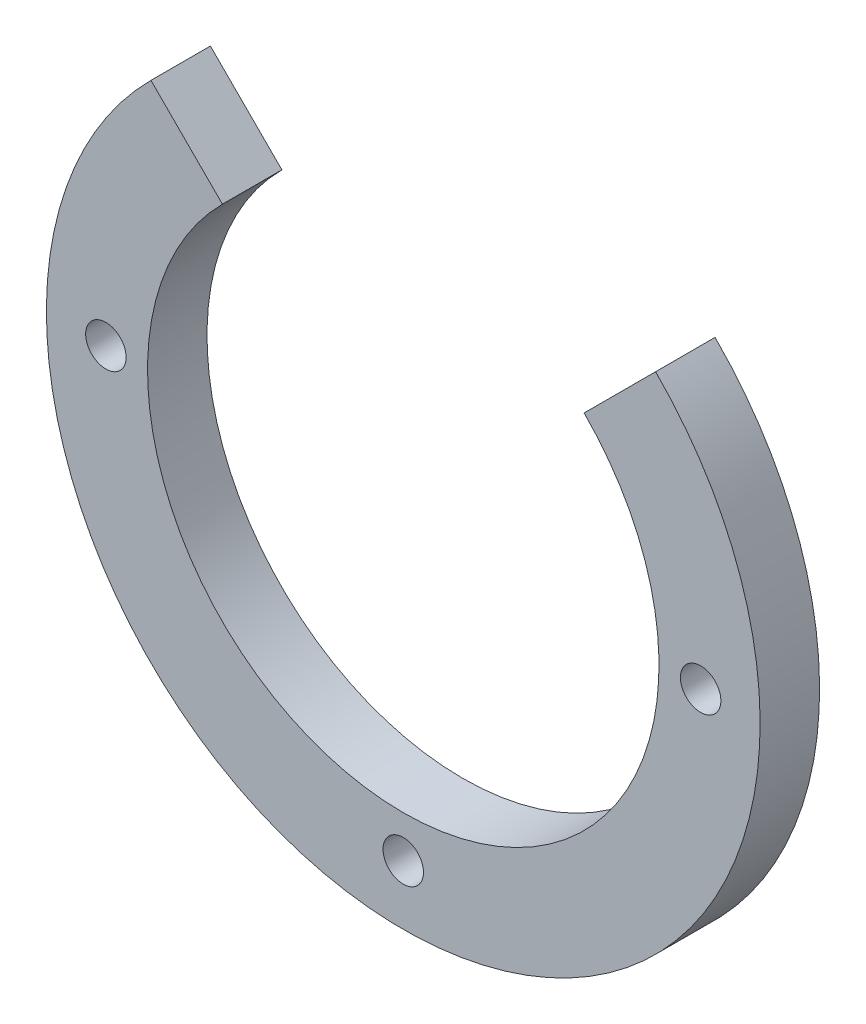
ISO-10303-21;
HEADER;
FILE_DESCRIPTION(('STEP AP214'),'2;1');
FILE_NAME('part.step','',(''),(''),'','','');
FILE_SCHEMA(('AUTOMOTIVE_DESIGN { 1 0 10303 214 1 1 1 1 }'));
ENDSEC;
DATA;
#1=APPLICATION_CONTEXT('core data for automotive mechanical design processes');
#2=APPLICATION_PROTOCOL_DEFINITION('international standard','automotive_design',2000,#1);
#3=PRODUCT_CONTEXT('',#1,'mechanical');
#4=PRODUCT('Part','Part','',(#3));
#5=PRODUCT_RELATED_PRODUCT_CATEGORY('part','',(#4));
#6=PRODUCT_DEFINITION_FORMATION('','',#4);
#7=PRODUCT_DEFINITION_CONTEXT('part definition',#1,'design');
#8=PRODUCT_DEFINITION('design','',#6,#7);
#9=PRODUCT_DEFINITION_SHAPE('','',#8);
#10=(LENGTH_UNIT() NAMED_UNIT(*) SI_UNIT(.MILLI.,.METRE.));
#11=(NAMED_UNIT(*) PLANE_ANGLE_UNIT() SI_UNIT($,.RADIAN.));
#12=(NAMED_UNIT(*) SI_UNIT($,.STERADIAN.) SOLID_ANGLE_UNIT());
#13=UNCERTAINTY_MEASURE_WITH_UNIT(LENGTH_MEASURE(1.E-05),#10,'distance_accuracy_value','');
#14=(GEOMETRIC_REPRESENTATION_CONTEXT(3) GLOBAL_UNCERTAINTY_ASSIGNED_CONTEXT((#13)) GLOBAL_UNIT_ASSIGNED_CONTEXT((#10,
#11,#12)) REPRESENTATION_CONTEXT('',''));
#15=CARTESIAN_POINT('',(0.,0.,0.));
#16=DIRECTION('',(0.,0.,1.));
#17=DIRECTION('',(1.,0.,0.));
#18=AXIS2_PLACEMENT_3D('',#15,#16,#17);
#19=CARTESIAN_POINT('',(0.,0.,5.));
#20=DIRECTION('',(0.,0.,1.));
#21=DIRECTION('',(1.,0.,0.));
#22=AXIS2_PLACEMENT_3D('',#19,#20,#21);
#23=PLANE('',#22);
#24=DIRECTION('',(0.707106781186551,0.707106781186544,0.));
#25=VECTOR('',#24,1.);
#26=CARTESIAN_POINT('',(21.2132034355965,21.2132034355963,5.));
#27=LINE('',#26,#25);
#28=CARTESIAN_POINT('',(15.2027957955108,15.2027957955107,5.));
#29=VERTEX_POINT('',#28);
#30=CARTESIAN_POINT('',(21.2132034355965,21.2132034355963,5.));
#31=VERTEX_POINT('',#30);
#32=EDGE_CURVE('E78',#29,#31,#27,.T.);
#33=ORIENTED_EDGE('',*,*,#32,.F.);
#34=CARTESIAN_POINT('',(0.,0.,5.));
#35=DIRECTION('',(0.,0.,1.));
#36=DIRECTION('',(1.,0.,0.));
#37=AXIS2_PLACEMENT_3D('',#34,#35,#36);
#38=CIRCLE('',#37,21.5);
#39=CARTESIAN_POINT('',(-15.2027957955109,15.2027957955107,5.));
#40=VERTEX_POINT('',#39);
#41=EDGE_CURVE('E97',#40,#29,#38,.T.);
#42=ORIENTED_EDGE('',*,*,#41,.F.);
#43=DIRECTION('',(0.707106781186551,-0.707106781186544,0.));
#44=VECTOR('',#43,1.);
#45=CARTESIAN_POINT('',(0.,0.,5.));
#46=LINE('',#45,#44);
#47=CARTESIAN_POINT('',(-21.2132034355965,21.2132034355963,5.));
#48=VERTEX_POINT('',#47);
#49=EDGE_CURVE('E59',#48,#40,#46,.T.);
#50=ORIENTED_EDGE('',*,*,#49,.F.);
#51=CARTESIAN_POINT('',(0.,0.,5.));
#52=DIRECTION('',(0.,0.,1.));
#53=DIRECTION('',(1.,0.,0.));
#54=AXIS2_PLACEMENT_3D('',#51,#52,#53);
#55=CIRCLE('',#54,30.);
#56=EDGE_CURVE('E96',#48,#31,#55,.T.);
#57=ORIENTED_EDGE('',*,*,#56,.T.);
#58=EDGE_LOOP('',(#33,#42,#50,#57));
#59=FACE_BOUND('',#58,.T.);
#60=CARTESIAN_POINT('',(-25.,0.,5.));
#61=DIRECTION('',(0.,0.,1.));
#62=DIRECTION('',(1.,0.,0.));
#63=AXIS2_PLACEMENT_3D('',#60,#61,#62);
#64=CIRCLE('',#63,1.7);
#65=CARTESIAN_POINT('',(-23.3,0.,5.));
#66=VERTEX_POINT('',#65);
#67=EDGE_CURVE('E124',#66,#66,#64,.T.);
#68=ORIENTED_EDGE('',*,*,#67,.F.);
#69=EDGE_LOOP('',(#68));
#70=FACE_BOUND('',#69,.T.);
#71=CARTESIAN_POINT('',(0.,-25.,5.));
#72=DIRECTION('',(0.,0.,1.));
#73=DIRECTION('',(1.,0.,0.));
#74=AXIS2_PLACEMENT_3D('',#71,#72,#73);
#75=CIRCLE('',#74,1.7);
#76=CARTESIAN_POINT('',(1.7,-25.,5.));
#77=VERTEX_POINT('',#76);
#78=EDGE_CURVE('E118',#77,#77,#75,.T.);
#79=ORIENTED_EDGE('',*,*,#78,.F.);
#80=EDGE_LOOP('',(#79));
#81=FACE_BOUND('',#80,.T.);
#82=CARTESIAN_POINT('',(25.,0.,5.));
#83=DIRECTION('',(0.,0.,1.));
#84=DIRECTION('',(1.,0.,0.));
#85=AXIS2_PLACEMENT_3D('',#82,#83,#84);
#86=CIRCLE('',#85,1.7);
#87=CARTESIAN_POINT('',(26.7,0.,5.));
#88=VERTEX_POINT('',#87);
#89=EDGE_CURVE('E110',#88,#88,#86,.T.);
#90=ORIENTED_EDGE('',*,*,#89,.F.);
#91=EDGE_LOOP('',(#90));
#92=FACE_BOUND('',#91,.T.);
#93=ADVANCED_FACE('F37',(#59,#70,#81,#92),#23,.T.);
#94=CARTESIAN_POINT('',(0.,0.,0.));
#95=DIRECTION('',(0.,0.,1.));
#96=DIRECTION('',(1.,0.,0.));
#97=AXIS2_PLACEMENT_3D('',#94,#95,#96);
#98=PLANE('',#97);
#99=CARTESIAN_POINT('',(-25.,0.,0.));
#100=DIRECTION('',(0.,0.,1.));
#101=DIRECTION('',(1.,0.,0.));
#102=AXIS2_PLACEMENT_3D('',#99,#100,#101);
#103=CIRCLE('',#102,1.7);
#104=CARTESIAN_POINT('',(-23.3,0.,0.));
#105=VERTEX_POINT('',#104);
#106=EDGE_CURVE('E121',#105,#105,#103,.T.);
#107=ORIENTED_EDGE('',*,*,#106,.T.);
#108=EDGE_LOOP('',(#107));
#109=FACE_BOUND('',#108,.T.);
#110=CARTESIAN_POINT('',(0.,-25.,0.));
#111=DIRECTION('',(0.,0.,1.));
#112=DIRECTION('',(1.,0.,0.));
#113=AXIS2_PLACEMENT_3D('',#110,#111,#112);
#114=CIRCLE('',#113,1.7);
#115=CARTESIAN_POINT('',(1.7,-25.,0.));
#116=VERTEX_POINT('',#115);
#117=EDGE_CURVE('E115',#116,#116,#114,.T.);
#118=ORIENTED_EDGE('',*,*,#117,.T.);
#119=EDGE_LOOP('',(#118));
#120=FACE_BOUND('',#119,.T.);
#121=CARTESIAN_POINT('',(25.,0.,0.));
#122=DIRECTION('',(0.,0.,1.));
#123=DIRECTION('',(1.,0.,0.));
#124=AXIS2_PLACEMENT_3D('',#121,#122,#123);
#125=CIRCLE('',#124,1.7);
#126=CARTESIAN_POINT('',(26.7,0.,0.));
#127=VERTEX_POINT('',#126);
#128=EDGE_CURVE('E108',#127,#127,#125,.T.);
#129=ORIENTED_EDGE('',*,*,#128,.T.);
#130=EDGE_LOOP('',(#129));
#131=FACE_BOUND('',#130,.T.);
#132=CARTESIAN_POINT('',(0.,0.,0.));
#133=DIRECTION('',(0.,0.,1.));
#134=DIRECTION('',(1.,0.,0.));
#135=AXIS2_PLACEMENT_3D('',#132,#133,#134);
#136=CIRCLE('',#135,21.5);
#137=CARTESIAN_POINT('',(-15.2027957955109,15.2027957955107,0.));
#138=VERTEX_POINT('',#137);
#139=CARTESIAN_POINT('',(15.2027957955108,15.2027957955107,0.));
#140=VERTEX_POINT('',#139);
#141=EDGE_CURVE('E93',#138,#140,#136,.T.);
#142=ORIENTED_EDGE('',*,*,#141,.T.);
#143=DIRECTION('',(0.707106781186551,0.707106781186544,0.));
#144=VECTOR('',#143,1.);
#145=CARTESIAN_POINT('',(21.2132034355965,21.2132034355963,0.));
#146=LINE('',#145,#144);
#147=CARTESIAN_POINT('',(21.2132034355965,21.2132034355963,0.));
#148=VERTEX_POINT('',#147);
#149=EDGE_CURVE('E51',#140,#148,#146,.T.);
#150=ORIENTED_EDGE('',*,*,#149,.T.);
#151=CARTESIAN_POINT('',(0.,0.,0.));
#152=DIRECTION('',(0.,0.,1.));
#153=DIRECTION('',(1.,0.,0.));
#154=AXIS2_PLACEMENT_3D('',#151,#152,#153);
#155=CIRCLE('',#154,30.);
#156=CARTESIAN_POINT('',(-21.2132034355965,21.2132034355963,0.));
#157=VERTEX_POINT('',#156);
#158=EDGE_CURVE('E91',#157,#148,#155,.T.);
#159=ORIENTED_EDGE('',*,*,#158,.F.);
#160=DIRECTION('',(0.707106781186551,-0.707106781186544,0.));
#161=VECTOR('',#160,1.);
#162=CARTESIAN_POINT('',(0.,0.,0.));
#163=LINE('',#162,#161);
#164=EDGE_CURVE('E84',#157,#138,#163,.T.);
#165=ORIENTED_EDGE('',*,*,#164,.T.);
#166=EDGE_LOOP('',(#142,#150,#159,#165));
#167=FACE_BOUND('',#166,.T.);
#168=ADVANCED_FACE('F89',(#109,#120,#131,#167),#98,.F.);
#169=CARTESIAN_POINT('',(0.,0.,5.));
#170=DIRECTION('',(0.,0.,-1.));
#171=DIRECTION('',(-1.,0.,0.));
#172=AXIS2_PLACEMENT_3D('',#169,#170,#171);
#173=CYLINDRICAL_SURFACE('',#172,30.);
#174=ORIENTED_EDGE('',*,*,#158,.T.);
#175=DIRECTION('',(0.,0.,1.));
#176=VECTOR('',#175,1.);
#177=CARTESIAN_POINT('',(21.2132034355965,21.2132034355963,0.));
#178=LINE('',#177,#176);
#179=EDGE_CURVE('E75',#148,#31,#178,.T.);
#180=ORIENTED_EDGE('',*,*,#179,.T.);
#181=ORIENTED_EDGE('',*,*,#56,.F.);
#182=DIRECTION('',(0.,0.,1.));
#183=VECTOR('',#182,1.);
#184=CARTESIAN_POINT('',(-21.2132034355965,21.2132034355963,0.));
#185=LINE('',#184,#183);
#186=EDGE_CURVE('E83',#157,#48,#185,.T.);
#187=ORIENTED_EDGE('',*,*,#186,.F.);
#188=EDGE_LOOP('',(#174,#180,#181,#187));
#189=FACE_BOUND('',#188,.T.);
#190=ADVANCED_FACE('F39',(#189),#173,.T.);
#191=CARTESIAN_POINT('',(0.,0.,5.));
#192=DIRECTION('',(0.,0.,-1.));
#193=DIRECTION('',(-1.,0.,0.));
#194=AXIS2_PLACEMENT_3D('',#191,#192,#193);
#195=CYLINDRICAL_SURFACE('',#194,21.5);
#196=DIRECTION('',(0.,0.,-1.));
#197=VECTOR('',#196,1.);
#198=CARTESIAN_POINT('',(15.2027957955108,15.2027957955107,5.));
#199=LINE('',#198,#197);
#200=EDGE_CURVE('E11',#140,#29,#199,.F.);
#201=ORIENTED_EDGE('',*,*,#200,.F.);
#202=ORIENTED_EDGE('',*,*,#141,.F.);
#203=DIRECTION('',(0.,0.,-1.));
#204=VECTOR('',#203,1.);
#205=CARTESIAN_POINT('',(-15.2027957955109,15.2027957955107,5.));
#206=LINE('',#205,#204);
#207=EDGE_CURVE('E45',#40,#138,#206,.T.);
#208=ORIENTED_EDGE('',*,*,#207,.F.);
#209=ORIENTED_EDGE('',*,*,#41,.T.);
#210=EDGE_LOOP('',(#201,#202,#208,#209));
#211=FACE_BOUND('',#210,.T.);
#212=ADVANCED_FACE('F107',(#211),#195,.F.);
#213=CARTESIAN_POINT('',(25.,0.,5.));
#214=DIRECTION('',(0.,0.,1.));
#215=DIRECTION('',(1.,0.,0.));
#216=AXIS2_PLACEMENT_3D('',#213,#214,#215);
#217=CYLINDRICAL_SURFACE('',#216,1.7);
#218=ORIENTED_EDGE('',*,*,#128,.F.);
#219=EDGE_LOOP('',(#218));
#220=FACE_BOUND('',#219,.T.);
#221=ORIENTED_EDGE('',*,*,#89,.T.);
#222=EDGE_LOOP('',(#221));
#223=FACE_BOUND('',#222,.T.);
#224=ADVANCED_FACE('F139',(#220,#223),#217,.F.);
#225=CARTESIAN_POINT('',(0.,-25.,5.));
#226=DIRECTION('',(0.,0.,1.));
#227=DIRECTION('',(1.,0.,0.));
#228=AXIS2_PLACEMENT_3D('',#225,#226,#227);
#229=CYLINDRICAL_SURFACE('',#228,1.7);
#230=ORIENTED_EDGE('',*,*,#117,.F.);
#231=EDGE_LOOP('',(#230));
#232=FACE_BOUND('',#231,.T.);
#233=ORIENTED_EDGE('',*,*,#78,.T.);
#234=EDGE_LOOP('',(#233));
#235=FACE_BOUND('',#234,.T.);
#236=ADVANCED_FACE('F141',(#232,#235),#229,.F.);
#237=CARTESIAN_POINT('',(-25.,0.,5.));
#238=DIRECTION('',(0.,0.,1.));
#239=DIRECTION('',(1.,0.,0.));
#240=AXIS2_PLACEMENT_3D('',#237,#238,#239);
#241=CYLINDRICAL_SURFACE('',#240,1.7);
#242=ORIENTED_EDGE('',*,*,#106,.F.);
#243=EDGE_LOOP('',(#242));
#244=FACE_BOUND('',#243,.T.);
#245=ORIENTED_EDGE('',*,*,#67,.T.);
#246=EDGE_LOOP('',(#245));
#247=FACE_BOUND('',#246,.T.);
#248=ADVANCED_FACE('F148',(#244,#247),#241,.F.);
#249=CARTESIAN_POINT('',(0.,0.,0.));
#250=DIRECTION('',(-0.707106781186544,-0.707106781186551,0.));
#251=DIRECTION('',(0.707106781186551,-0.707106781186544,0.));
#252=AXIS2_PLACEMENT_3D('',#249,#250,#251);
#253=PLANE('',#252);
#254=ORIENTED_EDGE('',*,*,#207,.T.);
#255=ORIENTED_EDGE('',*,*,#164,.F.);
#256=ORIENTED_EDGE('',*,*,#186,.T.);
#257=ORIENTED_EDGE('',*,*,#49,.T.);
#258=EDGE_LOOP('',(#254,#255,#256,#257));
#259=FACE_BOUND('',#258,.T.);
#260=ADVANCED_FACE('F103',(#259),#253,.F.);
#261=CARTESIAN_POINT('',(21.2132034355965,21.2132034355963,0.));
#262=DIRECTION('',(0.707106781186544,-0.707106781186551,0.));
#263=DIRECTION('',(0.707106781186551,0.707106781186544,0.));
#264=AXIS2_PLACEMENT_3D('',#261,#262,#263);
#265=PLANE('',#264);
#266=ORIENTED_EDGE('',*,*,#200,.T.);
#267=ORIENTED_EDGE('',*,*,#32,.T.);
#268=ORIENTED_EDGE('',*,*,#179,.F.);
#269=ORIENTED_EDGE('',*,*,#149,.F.);
#270=EDGE_LOOP('',(#266,#267,#268,#269));
#271=FACE_BOUND('',#270,.T.);
#272=ADVANCED_FACE('F76',(#271),#265,.F.);
#273=CLOSED_SHELL('',(#93,#168,#190,#212,#224,#236,#248,#260,#272));
#274=MANIFOLD_SOLID_BREP('B2',#273);
#275=ADVANCED_BREP_SHAPE_REPRESENTATION('',(#18,#274),#14);
#276=SHAPE_DEFINITION_REPRESENTATION(#9,#275);
ENDSEC;
END-ISO-10303-21;
